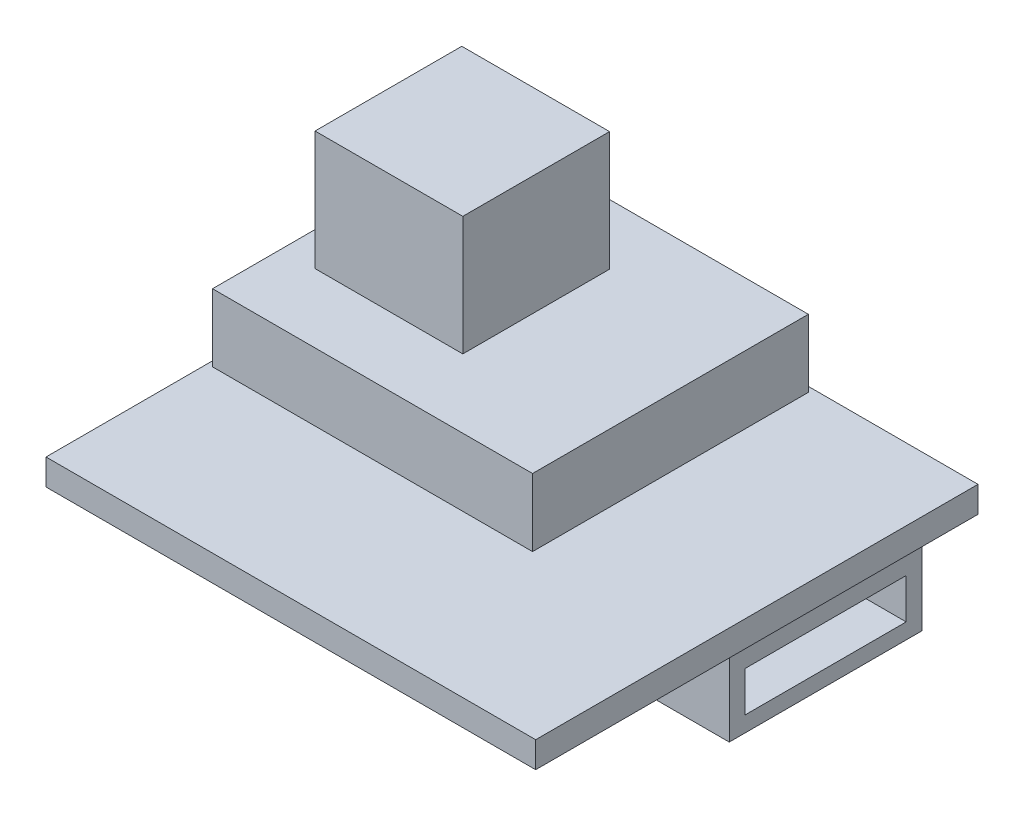
ISO-10303-21;
HEADER;
FILE_DESCRIPTION(('STEP AP214'),'2;1');
FILE_NAME('part.step','',(''),(''),'','','');
FILE_SCHEMA(('AUTOMOTIVE_DESIGN { 1 0 10303 214 1 1 1 1 }'));
ENDSEC;
DATA;
#1=APPLICATION_CONTEXT('core data for automotive mechanical design processes');
#2=APPLICATION_PROTOCOL_DEFINITION('international standard','automotive_design',2000,#1);
#3=PRODUCT_CONTEXT('',#1,'mechanical');
#4=PRODUCT('Part','Part','',(#3));
#5=PRODUCT_RELATED_PRODUCT_CATEGORY('part','',(#4));
#6=PRODUCT_DEFINITION_FORMATION('','',#4);
#7=PRODUCT_DEFINITION_CONTEXT('part definition',#1,'design');
#8=PRODUCT_DEFINITION('design','',#6,#7);
#9=PRODUCT_DEFINITION_SHAPE('','',#8);
#10=(LENGTH_UNIT() NAMED_UNIT(*) SI_UNIT(.MILLI.,.METRE.));
#11=(NAMED_UNIT(*) PLANE_ANGLE_UNIT() SI_UNIT($,.RADIAN.));
#12=(NAMED_UNIT(*) SI_UNIT($,.STERADIAN.) SOLID_ANGLE_UNIT());
#13=UNCERTAINTY_MEASURE_WITH_UNIT(LENGTH_MEASURE(1.E-05),#10,'distance_accuracy_value','');
#14=(GEOMETRIC_REPRESENTATION_CONTEXT(3) GLOBAL_UNCERTAINTY_ASSIGNED_CONTEXT((#13)) GLOBAL_UNIT_ASSIGNED_CONTEXT((#10,
#11,#12)) REPRESENTATION_CONTEXT('',''));
#15=CARTESIAN_POINT('',(0.,0.,0.));
#16=DIRECTION('',(0.,0.,1.));
#17=DIRECTION('',(1.,0.,0.));
#18=AXIS2_PLACEMENT_3D('',#15,#16,#17);
#19=CARTESIAN_POINT('',(0.,0.,0.));
#20=DIRECTION('',(0.,-1.,0.));
#21=DIRECTION('',(0.,0.,-1.));
#22=AXIS2_PLACEMENT_3D('',#19,#20,#21);
#23=PLANE('',#22);
#24=DIRECTION('',(1.,0.,0.));
#25=VECTOR('',#24,1.);
#26=CARTESIAN_POINT('',(8.6614,0.,-16.8656));
#27=LINE('',#26,#25);
#28=CARTESIAN_POINT('',(8.6614,0.,-16.8656));
#29=VERTEX_POINT('',#28);
#30=CARTESIAN_POINT('',(12.8524,0.,-16.8656));
#31=VERTEX_POINT('',#30);
#32=EDGE_CURVE('E279',#29,#31,#27,.T.);
#33=ORIENTED_EDGE('',*,*,#32,.F.);
#34=DIRECTION('',(0.,0.,-1.));
#35=VECTOR('',#34,1.);
#36=CARTESIAN_POINT('',(8.6614,0.,-9.8298));
#37=LINE('',#36,#35);
#38=CARTESIAN_POINT('',(8.6614,0.,-9.8298));
#39=VERTEX_POINT('',#38);
#40=EDGE_CURVE('E265',#39,#29,#37,.T.);
#41=ORIENTED_EDGE('',*,*,#40,.F.);
#42=DIRECTION('',(-1.,0.,0.));
#43=VECTOR('',#42,1.);
#44=CARTESIAN_POINT('',(8.6614,0.,-9.8298));
#45=LINE('',#44,#43);
#46=CARTESIAN_POINT('',(12.8524,0.,-9.8298));
#47=VERTEX_POINT('',#46);
#48=EDGE_CURVE('E270',#47,#39,#45,.T.);
#49=ORIENTED_EDGE('',*,*,#48,.F.);
#50=DIRECTION('',(0.,0.,1.));
#51=VECTOR('',#50,1.);
#52=CARTESIAN_POINT('',(12.8524,0.,-9.8298));
#53=LINE('',#52,#51);
#54=EDGE_CURVE('E281',#31,#47,#53,.T.);
#55=ORIENTED_EDGE('',*,*,#54,.F.);
#56=EDGE_LOOP('',(#33,#41,#49,#55));
#57=FACE_BOUND('',#56,.T.);
#58=DIRECTION('',(0.,0.,1.));
#59=VECTOR('',#58,1.);
#60=CARTESIAN_POINT('',(0.,0.,0.));
#61=LINE('',#60,#59);
#62=CARTESIAN_POINT('',(0.,0.,-21.59));
#63=VERTEX_POINT('',#62);
#64=CARTESIAN_POINT('',(0.,0.,0.));
#65=VERTEX_POINT('',#64);
#66=EDGE_CURVE('E356',#63,#65,#61,.T.);
#67=ORIENTED_EDGE('',*,*,#66,.F.);
#68=DIRECTION('',(-1.,0.,0.));
#69=VECTOR('',#68,1.);
#70=CARTESIAN_POINT('',(0.,0.,-21.59));
#71=LINE('',#70,#69);
#72=CARTESIAN_POINT('',(23.9014,0.,-21.59));
#73=VERTEX_POINT('',#72);
#74=EDGE_CURVE('E361',#73,#63,#71,.T.);
#75=ORIENTED_EDGE('',*,*,#74,.F.);
#76=DIRECTION('',(0.,0.,-1.));
#77=VECTOR('',#76,1.);
#78=CARTESIAN_POINT('',(23.9014,0.,0.));
#79=LINE('',#78,#77);
#80=CARTESIAN_POINT('',(23.9014,0.,0.));
#81=VERTEX_POINT('',#80);
#82=EDGE_CURVE('E372',#81,#73,#79,.T.);
#83=ORIENTED_EDGE('',*,*,#82,.F.);
#84=DIRECTION('',(1.,0.,0.));
#85=VECTOR('',#84,1.);
#86=CARTESIAN_POINT('',(0.,0.,0.));
#87=LINE('',#86,#85);
#88=EDGE_CURVE('E370',#65,#81,#87,.T.);
#89=ORIENTED_EDGE('',*,*,#88,.F.);
#90=EDGE_LOOP('',(#67,#75,#83,#89));
#91=FACE_BOUND('',#90,.T.);
#92=DIRECTION('',(1.,0.,0.));
#93=VECTOR('',#92,1.);
#94=CARTESIAN_POINT('',(19.0754,0.,-19.1008));
#95=LINE('',#94,#93);
#96=CARTESIAN_POINT('',(19.0754,0.,-19.1008));
#97=VERTEX_POINT('',#96);
#98=CARTESIAN_POINT('',(23.6474,0.,-19.1008));
#99=VERTEX_POINT('',#98);
#100=EDGE_CURVE('E252',#97,#99,#95,.T.);
#101=ORIENTED_EDGE('',*,*,#100,.F.);
#102=DIRECTION('',(0.,0.,-1.));
#103=VECTOR('',#102,1.);
#104=CARTESIAN_POINT('',(19.0754,0.,-9.7028));
#105=LINE('',#104,#103);
#106=CARTESIAN_POINT('',(19.0754,0.,-9.7028));
#107=VERTEX_POINT('',#106);
#108=EDGE_CURVE('E237',#107,#97,#105,.T.);
#109=ORIENTED_EDGE('',*,*,#108,.F.);
#110=DIRECTION('',(-1.,0.,0.));
#111=VECTOR('',#110,1.);
#112=CARTESIAN_POINT('',(19.0754,0.,-9.7028));
#113=LINE('',#112,#111);
#114=CARTESIAN_POINT('',(23.6474,0.,-9.7028));
#115=VERTEX_POINT('',#114);
#116=EDGE_CURVE('E243',#115,#107,#113,.T.);
#117=ORIENTED_EDGE('',*,*,#116,.F.);
#118=DIRECTION('',(0.,0.,1.));
#119=VECTOR('',#118,1.);
#120=CARTESIAN_POINT('',(23.6474,0.,-9.7028));
#121=LINE('',#120,#119);
#122=EDGE_CURVE('E254',#99,#115,#121,.T.);
#123=ORIENTED_EDGE('',*,*,#122,.F.);
#124=EDGE_LOOP('',(#101,#109,#117,#123));
#125=FACE_BOUND('',#124,.T.);
#126=ADVANCED_FACE('F41',(#57,#91,#125),#23,.T.);
#127=CARTESIAN_POINT('',(0.,4.572,0.));
#128=DIRECTION('',(0.,1.,0.));
#129=DIRECTION('',(0.,0.,1.));
#130=AXIS2_PLACEMENT_3D('',#127,#128,#129);
#131=PLANE('',#130);
#132=DIRECTION('',(0.,0.,1.));
#133=VECTOR('',#132,1.);
#134=CARTESIAN_POINT('',(0.253999999999993,4.572,-21.336));
#135=LINE('',#134,#133);
#136=CARTESIAN_POINT('',(0.253999999999993,4.572,-21.336));
#137=VERTEX_POINT('',#136);
#138=CARTESIAN_POINT('',(0.253999999999995,4.572,-7.874));
#139=VERTEX_POINT('',#138);
#140=EDGE_CURVE('E324',#137,#139,#135,.T.);
#141=ORIENTED_EDGE('',*,*,#140,.T.);
#142=DIRECTION('',(1.,0.,0.));
#143=VECTOR('',#142,1.);
#144=CARTESIAN_POINT('',(0.253999999999995,4.572,-7.874));
#145=LINE('',#144,#143);
#146=CARTESIAN_POINT('',(15.875,4.572,-7.874));
#147=VERTEX_POINT('',#146);
#148=EDGE_CURVE('E327',#139,#147,#145,.T.);
#149=ORIENTED_EDGE('',*,*,#148,.T.);
#150=DIRECTION('',(0.,0.,-1.));
#151=VECTOR('',#150,1.);
#152=CARTESIAN_POINT('',(15.875,4.572,-21.336));
#153=LINE('',#152,#151);
#154=CARTESIAN_POINT('',(15.875,4.572,-21.336));
#155=VERTEX_POINT('',#154);
#156=EDGE_CURVE('E330',#147,#155,#153,.T.);
#157=ORIENTED_EDGE('',*,*,#156,.T.);
#158=DIRECTION('',(-1.,0.,0.));
#159=VECTOR('',#158,1.);
#160=CARTESIAN_POINT('',(0.253999999999993,4.572,-21.336));
#161=LINE('',#160,#159);
#162=EDGE_CURVE('E332',#155,#137,#161,.T.);
#163=ORIENTED_EDGE('',*,*,#162,.T.);
#164=EDGE_LOOP('',(#141,#149,#157,#163));
#165=FACE_BOUND('',#164,.T.);
#166=DIRECTION('',(1.,0.,0.));
#167=VECTOR('',#166,1.);
#168=CARTESIAN_POINT('',(1.90499999999999,4.572,-11.2268));
#169=LINE('',#168,#167);
#170=CARTESIAN_POINT('',(1.90499999999999,4.572,-11.2268));
#171=VERTEX_POINT('',#170);
#172=CARTESIAN_POINT('',(9.11859999999999,4.572,-11.2268));
#173=VERTEX_POINT('',#172);
#174=EDGE_CURVE('E308',#171,#173,#169,.T.);
#175=ORIENTED_EDGE('',*,*,#174,.F.);
#176=DIRECTION('',(0.,0.,1.));
#177=VECTOR('',#176,1.);
#178=CARTESIAN_POINT('',(1.90499999999999,4.572,-18.3896));
#179=LINE('',#178,#177);
#180=CARTESIAN_POINT('',(1.90499999999999,4.572,-18.3896));
#181=VERTEX_POINT('',#180);
#182=EDGE_CURVE('E294',#181,#171,#179,.T.);
#183=ORIENTED_EDGE('',*,*,#182,.F.);
#184=DIRECTION('',(-1.,0.,0.));
#185=VECTOR('',#184,1.);
#186=CARTESIAN_POINT('',(1.90499999999999,4.572,-18.3896));
#187=LINE('',#186,#185);
#188=CARTESIAN_POINT('',(9.11859999999999,4.572,-18.3896));
#189=VERTEX_POINT('',#188);
#190=EDGE_CURVE('E299',#189,#181,#187,.T.);
#191=ORIENTED_EDGE('',*,*,#190,.F.);
#192=DIRECTION('',(0.,0.,-1.));
#193=VECTOR('',#192,1.);
#194=CARTESIAN_POINT('',(9.11859999999999,4.572,-18.3896));
#195=LINE('',#194,#193);
#196=EDGE_CURVE('E310',#173,#189,#195,.T.);
#197=ORIENTED_EDGE('',*,*,#196,.F.);
#198=EDGE_LOOP('',(#175,#183,#191,#197));
#199=FACE_BOUND('',#198,.T.);
#200=ADVANCED_FACE('F409',(#165,#199),#131,.T.);
#201=CARTESIAN_POINT('',(0.,1.27,0.));
#202=DIRECTION('',(0.,-1.,0.));
#203=DIRECTION('',(0.,0.,-1.));
#204=AXIS2_PLACEMENT_3D('',#201,#202,#203);
#205=PLANE('',#204);
#206=DIRECTION('',(0.,0.,1.));
#207=VECTOR('',#206,1.);
#208=CARTESIAN_POINT('',(0.,1.27,0.));
#209=LINE('',#208,#207);
#210=CARTESIAN_POINT('',(0.,1.27,-21.59));
#211=VERTEX_POINT('',#210);
#212=CARTESIAN_POINT('',(0.,1.27,0.));
#213=VERTEX_POINT('',#212);
#214=EDGE_CURVE('E357',#211,#213,#209,.T.);
#215=ORIENTED_EDGE('',*,*,#214,.T.);
#216=DIRECTION('',(1.,0.,0.));
#217=VECTOR('',#216,1.);
#218=CARTESIAN_POINT('',(0.,1.27,0.));
#219=LINE('',#218,#217);
#220=CARTESIAN_POINT('',(23.9014,1.27,0.));
#221=VERTEX_POINT('',#220);
#222=EDGE_CURVE('E360',#213,#221,#219,.T.);
#223=ORIENTED_EDGE('',*,*,#222,.T.);
#224=DIRECTION('',(0.,0.,-1.));
#225=VECTOR('',#224,1.);
#226=CARTESIAN_POINT('',(23.9014,1.27,0.));
#227=LINE('',#226,#225);
#228=CARTESIAN_POINT('',(23.9014,1.27,-21.59));
#229=VERTEX_POINT('',#228);
#230=EDGE_CURVE('E363',#221,#229,#227,.T.);
#231=ORIENTED_EDGE('',*,*,#230,.T.);
#232=DIRECTION('',(-1.,0.,0.));
#233=VECTOR('',#232,1.);
#234=CARTESIAN_POINT('',(0.,1.27,-21.59));
#235=LINE('',#234,#233);
#236=EDGE_CURVE('E365',#229,#211,#235,.T.);
#237=ORIENTED_EDGE('',*,*,#236,.T.);
#238=EDGE_LOOP('',(#215,#223,#231,#237));
#239=FACE_BOUND('',#238,.T.);
#240=DIRECTION('',(0.,0.,1.));
#241=VECTOR('',#240,1.);
#242=CARTESIAN_POINT('',(0.253999999999993,1.27,-21.336));
#243=LINE('',#242,#241);
#244=CARTESIAN_POINT('',(0.253999999999993,1.27,-21.336));
#245=VERTEX_POINT('',#244);
#246=CARTESIAN_POINT('',(0.253999999999995,1.27,-7.874));
#247=VERTEX_POINT('',#246);
#248=EDGE_CURVE('E323',#245,#247,#243,.T.);
#249=ORIENTED_EDGE('',*,*,#248,.F.);
#250=DIRECTION('',(-1.,0.,0.));
#251=VECTOR('',#250,1.);
#252=CARTESIAN_POINT('',(0.253999999999993,1.27,-21.336));
#253=LINE('',#252,#251);
#254=CARTESIAN_POINT('',(15.875,1.27,-21.336));
#255=VERTEX_POINT('',#254);
#256=EDGE_CURVE('E328',#255,#245,#253,.T.);
#257=ORIENTED_EDGE('',*,*,#256,.F.);
#258=DIRECTION('',(0.,0.,-1.));
#259=VECTOR('',#258,1.);
#260=CARTESIAN_POINT('',(15.875,1.27,-21.336));
#261=LINE('',#260,#259);
#262=CARTESIAN_POINT('',(15.875,1.27,-7.874));
#263=VERTEX_POINT('',#262);
#264=EDGE_CURVE('E340',#263,#255,#261,.T.);
#265=ORIENTED_EDGE('',*,*,#264,.F.);
#266=DIRECTION('',(1.,0.,0.));
#267=VECTOR('',#266,1.);
#268=CARTESIAN_POINT('',(0.253999999999995,1.27,-7.874));
#269=LINE('',#268,#267);
#270=EDGE_CURVE('E337',#247,#263,#269,.T.);
#271=ORIENTED_EDGE('',*,*,#270,.F.);
#272=EDGE_LOOP('',(#249,#257,#265,#271));
#273=FACE_BOUND('',#272,.T.);
#274=ADVANCED_FACE('F399',(#239,#273),#205,.F.);
#275=CARTESIAN_POINT('',(0.,1.27,0.));
#276=DIRECTION('',(1.,0.,0.));
#277=DIRECTION('',(0.,0.,-1.));
#278=AXIS2_PLACEMENT_3D('',#275,#276,#277);
#279=PLANE('',#278);
#280=ORIENTED_EDGE('',*,*,#66,.T.);
#281=DIRECTION('',(0.,-1.,0.));
#282=VECTOR('',#281,1.);
#283=CARTESIAN_POINT('',(0.,1.27,0.));
#284=LINE('',#283,#282);
#285=EDGE_CURVE('E12',#213,#65,#284,.T.);
#286=ORIENTED_EDGE('',*,*,#285,.F.);
#287=ORIENTED_EDGE('',*,*,#214,.F.);
#288=DIRECTION('',(0.,-1.,0.));
#289=VECTOR('',#288,1.);
#290=CARTESIAN_POINT('',(0.,1.27,-21.59));
#291=LINE('',#290,#289);
#292=EDGE_CURVE('E367',#211,#63,#291,.T.);
#293=ORIENTED_EDGE('',*,*,#292,.T.);
#294=EDGE_LOOP('',(#280,#286,#287,#293));
#295=FACE_BOUND('',#294,.T.);
#296=ADVANCED_FACE('F43',(#295),#279,.F.);
#297=CARTESIAN_POINT('',(0.,1.27,0.));
#298=DIRECTION('',(0.,0.,-1.));
#299=DIRECTION('',(-1.,0.,0.));
#300=AXIS2_PLACEMENT_3D('',#297,#298,#299);
#301=PLANE('',#300);
#302=ORIENTED_EDGE('',*,*,#88,.T.);
#303=DIRECTION('',(0.,-1.,0.));
#304=VECTOR('',#303,1.);
#305=CARTESIAN_POINT('',(23.9014,1.27,0.));
#306=LINE('',#305,#304);
#307=EDGE_CURVE('E49',#221,#81,#306,.T.);
#308=ORIENTED_EDGE('',*,*,#307,.F.);
#309=ORIENTED_EDGE('',*,*,#222,.F.);
#310=ORIENTED_EDGE('',*,*,#285,.T.);
#311=EDGE_LOOP('',(#302,#308,#309,#310));
#312=FACE_BOUND('',#311,.T.);
#313=ADVANCED_FACE('F401',(#312),#301,.F.);
#314=CARTESIAN_POINT('',(23.9014,1.27,0.));
#315=DIRECTION('',(-1.,0.,0.));
#316=DIRECTION('',(0.,0.,1.));
#317=AXIS2_PLACEMENT_3D('',#314,#315,#316);
#318=PLANE('',#317);
#319=ORIENTED_EDGE('',*,*,#82,.T.);
#320=DIRECTION('',(0.,-1.,0.));
#321=VECTOR('',#320,1.);
#322=CARTESIAN_POINT('',(23.9014,1.27,-21.59));
#323=LINE('',#322,#321);
#324=EDGE_CURVE('E377',#229,#73,#323,.T.);
#325=ORIENTED_EDGE('',*,*,#324,.F.);
#326=ORIENTED_EDGE('',*,*,#230,.F.);
#327=ORIENTED_EDGE('',*,*,#307,.T.);
#328=EDGE_LOOP('',(#319,#325,#326,#327));
#329=FACE_BOUND('',#328,.T.);
#330=ADVANCED_FACE('F384',(#329),#318,.F.);
#331=CARTESIAN_POINT('',(0.,1.27,-21.59));
#332=DIRECTION('',(0.,0.,1.));
#333=DIRECTION('',(1.,0.,0.));
#334=AXIS2_PLACEMENT_3D('',#331,#332,#333);
#335=PLANE('',#334);
#336=ORIENTED_EDGE('',*,*,#74,.T.);
#337=ORIENTED_EDGE('',*,*,#292,.F.);
#338=ORIENTED_EDGE('',*,*,#236,.F.);
#339=ORIENTED_EDGE('',*,*,#324,.T.);
#340=EDGE_LOOP('',(#336,#337,#338,#339));
#341=FACE_BOUND('',#340,.T.);
#342=ADVANCED_FACE('F393',(#341),#335,.F.);
#343=CARTESIAN_POINT('',(0.253999999999993,4.572,-21.336));
#344=DIRECTION('',(1.,0.,0.));
#345=DIRECTION('',(0.,0.,-1.));
#346=AXIS2_PLACEMENT_3D('',#343,#344,#345);
#347=PLANE('',#346);
#348=ORIENTED_EDGE('',*,*,#248,.T.);
#349=DIRECTION('',(0.,-1.,0.));
#350=VECTOR('',#349,1.);
#351=CARTESIAN_POINT('',(0.253999999999995,4.572,-7.874));
#352=LINE('',#351,#350);
#353=EDGE_CURVE('E353',#139,#247,#352,.T.);
#354=ORIENTED_EDGE('',*,*,#353,.F.);
#355=ORIENTED_EDGE('',*,*,#140,.F.);
#356=DIRECTION('',(0.,-1.,0.));
#357=VECTOR('',#356,1.);
#358=CARTESIAN_POINT('',(0.253999999999993,4.572,-21.336));
#359=LINE('',#358,#357);
#360=EDGE_CURVE('E334',#137,#245,#359,.T.);
#361=ORIENTED_EDGE('',*,*,#360,.T.);
#362=EDGE_LOOP('',(#348,#354,#355,#361));
#363=FACE_BOUND('',#362,.T.);
#364=ADVANCED_FACE('F422',(#363),#347,.F.);
#365=CARTESIAN_POINT('',(0.253999999999995,4.572,-7.874));
#366=DIRECTION('',(0.,0.,-1.));
#367=DIRECTION('',(-1.,0.,0.));
#368=AXIS2_PLACEMENT_3D('',#365,#366,#367);
#369=PLANE('',#368);
#370=ORIENTED_EDGE('',*,*,#270,.T.);
#371=DIRECTION('',(0.,-1.,0.));
#372=VECTOR('',#371,1.);
#373=CARTESIAN_POINT('',(15.875,4.572,-7.874));
#374=LINE('',#373,#372);
#375=EDGE_CURVE('E350',#147,#263,#374,.T.);
#376=ORIENTED_EDGE('',*,*,#375,.F.);
#377=ORIENTED_EDGE('',*,*,#148,.F.);
#378=ORIENTED_EDGE('',*,*,#353,.T.);
#379=EDGE_LOOP('',(#370,#376,#377,#378));
#380=FACE_BOUND('',#379,.T.);
#381=ADVANCED_FACE('F426',(#380),#369,.F.);
#382=CARTESIAN_POINT('',(15.875,4.572,-21.336));
#383=DIRECTION('',(-1.,0.,0.));
#384=DIRECTION('',(0.,0.,1.));
#385=AXIS2_PLACEMENT_3D('',#382,#383,#384);
#386=PLANE('',#385);
#387=ORIENTED_EDGE('',*,*,#264,.T.);
#388=DIRECTION('',(0.,-1.,0.));
#389=VECTOR('',#388,1.);
#390=CARTESIAN_POINT('',(15.875,4.572,-21.336));
#391=LINE('',#390,#389);
#392=EDGE_CURVE('E347',#155,#255,#391,.T.);
#393=ORIENTED_EDGE('',*,*,#392,.F.);
#394=ORIENTED_EDGE('',*,*,#156,.F.);
#395=ORIENTED_EDGE('',*,*,#375,.T.);
#396=EDGE_LOOP('',(#387,#393,#394,#395));
#397=FACE_BOUND('',#396,.T.);
#398=ADVANCED_FACE('F431',(#397),#386,.F.);
#399=CARTESIAN_POINT('',(0.253999999999993,4.572,-21.336));
#400=DIRECTION('',(0.,0.,1.));
#401=DIRECTION('',(1.,0.,0.));
#402=AXIS2_PLACEMENT_3D('',#399,#400,#401);
#403=PLANE('',#402);
#404=ORIENTED_EDGE('',*,*,#256,.T.);
#405=ORIENTED_EDGE('',*,*,#360,.F.);
#406=ORIENTED_EDGE('',*,*,#162,.F.);
#407=ORIENTED_EDGE('',*,*,#392,.T.);
#408=EDGE_LOOP('',(#404,#405,#406,#407));
#409=FACE_BOUND('',#408,.T.);
#410=ADVANCED_FACE('F437',(#409),#403,.F.);
#411=CARTESIAN_POINT('',(1.90499999999999,10.3886,-18.3896));
#412=DIRECTION('',(1.,0.,0.));
#413=DIRECTION('',(0.,0.,-1.));
#414=AXIS2_PLACEMENT_3D('',#411,#412,#413);
#415=PLANE('',#414);
#416=ORIENTED_EDGE('',*,*,#182,.T.);
#417=DIRECTION('',(0.,-1.,0.));
#418=VECTOR('',#417,1.);
#419=CARTESIAN_POINT('',(1.90499999999999,10.3886,-11.2268));
#420=LINE('',#419,#418);
#421=CARTESIAN_POINT('',(1.90499999999999,10.3886,-11.2268));
#422=VERTEX_POINT('',#421);
#423=EDGE_CURVE('E321',#422,#171,#420,.T.);
#424=ORIENTED_EDGE('',*,*,#423,.F.);
#425=DIRECTION('',(0.,0.,1.));
#426=VECTOR('',#425,1.);
#427=CARTESIAN_POINT('',(1.90499999999999,10.3886,-18.3896));
#428=LINE('',#427,#426);
#429=CARTESIAN_POINT('',(1.90499999999999,10.3886,-18.3896));
#430=VERTEX_POINT('',#429);
#431=EDGE_CURVE('E295',#430,#422,#428,.T.);
#432=ORIENTED_EDGE('',*,*,#431,.F.);
#433=DIRECTION('',(0.,-1.,0.));
#434=VECTOR('',#433,1.);
#435=CARTESIAN_POINT('',(1.90499999999999,10.3886,-18.3896));
#436=LINE('',#435,#434);
#437=EDGE_CURVE('E305',#430,#181,#436,.T.);
#438=ORIENTED_EDGE('',*,*,#437,.T.);
#439=EDGE_LOOP('',(#416,#424,#432,#438));
#440=FACE_BOUND('',#439,.T.);
#441=ADVANCED_FACE('F440',(#440),#415,.F.);
#442=CARTESIAN_POINT('',(1.90499999999999,10.3886,-11.2268));
#443=DIRECTION('',(0.,0.,-1.));
#444=DIRECTION('',(-1.,0.,0.));
#445=AXIS2_PLACEMENT_3D('',#442,#443,#444);
#446=PLANE('',#445);
#447=ORIENTED_EDGE('',*,*,#174,.T.);
#448=DIRECTION('',(0.,-1.,0.));
#449=VECTOR('',#448,1.);
#450=CARTESIAN_POINT('',(9.11859999999999,10.3886,-11.2268));
#451=LINE('',#450,#449);
#452=CARTESIAN_POINT('',(9.11859999999999,10.3886,-11.2268));
#453=VERTEX_POINT('',#452);
#454=EDGE_CURVE('E318',#453,#173,#451,.T.);
#455=ORIENTED_EDGE('',*,*,#454,.F.);
#456=DIRECTION('',(1.,0.,0.));
#457=VECTOR('',#456,1.);
#458=CARTESIAN_POINT('',(1.90499999999999,10.3886,-11.2268));
#459=LINE('',#458,#457);
#460=EDGE_CURVE('E298',#422,#453,#459,.T.);
#461=ORIENTED_EDGE('',*,*,#460,.F.);
#462=ORIENTED_EDGE('',*,*,#423,.T.);
#463=EDGE_LOOP('',(#447,#455,#461,#462));
#464=FACE_BOUND('',#463,.T.);
#465=ADVANCED_FACE('F445',(#464),#446,.F.);
#466=CARTESIAN_POINT('',(9.11859999999999,10.3886,-18.3896));
#467=DIRECTION('',(-1.,0.,0.));
#468=DIRECTION('',(0.,0.,1.));
#469=AXIS2_PLACEMENT_3D('',#466,#467,#468);
#470=PLANE('',#469);
#471=ORIENTED_EDGE('',*,*,#196,.T.);
#472=DIRECTION('',(0.,-1.,0.));
#473=VECTOR('',#472,1.);
#474=CARTESIAN_POINT('',(9.11859999999999,10.3886,-18.3896));
#475=LINE('',#474,#473);
#476=CARTESIAN_POINT('',(9.11859999999999,10.3886,-18.3896));
#477=VERTEX_POINT('',#476);
#478=EDGE_CURVE('E316',#477,#189,#475,.T.);
#479=ORIENTED_EDGE('',*,*,#478,.F.);
#480=DIRECTION('',(0.,0.,-1.));
#481=VECTOR('',#480,1.);
#482=CARTESIAN_POINT('',(9.11859999999999,10.3886,-18.3896));
#483=LINE('',#482,#481);
#484=EDGE_CURVE('E301',#453,#477,#483,.T.);
#485=ORIENTED_EDGE('',*,*,#484,.F.);
#486=ORIENTED_EDGE('',*,*,#454,.T.);
#487=EDGE_LOOP('',(#471,#479,#485,#486));
#488=FACE_BOUND('',#487,.T.);
#489=ADVANCED_FACE('F449',(#488),#470,.F.);
#490=CARTESIAN_POINT('',(1.90499999999999,10.3886,-18.3896));
#491=DIRECTION('',(0.,0.,1.));
#492=DIRECTION('',(1.,0.,0.));
#493=AXIS2_PLACEMENT_3D('',#490,#491,#492);
#494=PLANE('',#493);
#495=ORIENTED_EDGE('',*,*,#190,.T.);
#496=ORIENTED_EDGE('',*,*,#437,.F.);
#497=DIRECTION('',(-1.,0.,0.));
#498=VECTOR('',#497,1.);
#499=CARTESIAN_POINT('',(1.90499999999999,10.3886,-18.3896));
#500=LINE('',#499,#498);
#501=EDGE_CURVE('E303',#477,#430,#500,.T.);
#502=ORIENTED_EDGE('',*,*,#501,.F.);
#503=ORIENTED_EDGE('',*,*,#478,.T.);
#504=EDGE_LOOP('',(#495,#496,#502,#503));
#505=FACE_BOUND('',#504,.T.);
#506=ADVANCED_FACE('F453',(#505),#494,.F.);
#507=CARTESIAN_POINT('',(0.,10.3886,0.));
#508=DIRECTION('',(0.,1.,0.));
#509=DIRECTION('',(0.,0.,1.));
#510=AXIS2_PLACEMENT_3D('',#507,#508,#509);
#511=PLANE('',#510);
#512=ORIENTED_EDGE('',*,*,#431,.T.);
#513=ORIENTED_EDGE('',*,*,#460,.T.);
#514=ORIENTED_EDGE('',*,*,#484,.T.);
#515=ORIENTED_EDGE('',*,*,#501,.T.);
#516=EDGE_LOOP('',(#512,#513,#514,#515));
#517=FACE_BOUND('',#516,.T.);
#518=ADVANCED_FACE('F457',(#517),#511,.T.);
#519=CARTESIAN_POINT('',(8.6614,-4.5212,-9.8298));
#520=DIRECTION('',(1.,0.,0.));
#521=DIRECTION('',(0.,0.,-1.));
#522=AXIS2_PLACEMENT_3D('',#519,#520,#521);
#523=PLANE('',#522);
#524=ORIENTED_EDGE('',*,*,#40,.T.);
#525=DIRECTION('',(0.,1.,0.));
#526=VECTOR('',#525,1.);
#527=CARTESIAN_POINT('',(8.6614,-4.5212,-16.8656));
#528=LINE('',#527,#526);
#529=CARTESIAN_POINT('',(8.6614,-4.5212,-16.8656));
#530=VERTEX_POINT('',#529);
#531=EDGE_CURVE('E292',#530,#29,#528,.T.);
#532=ORIENTED_EDGE('',*,*,#531,.F.);
#533=DIRECTION('',(0.,0.,-1.));
#534=VECTOR('',#533,1.);
#535=CARTESIAN_POINT('',(8.6614,-4.5212,-9.8298));
#536=LINE('',#535,#534);
#537=CARTESIAN_POINT('',(8.6614,-4.5212,-9.8298));
#538=VERTEX_POINT('',#537);
#539=EDGE_CURVE('E266',#538,#530,#536,.T.);
#540=ORIENTED_EDGE('',*,*,#539,.F.);
#541=DIRECTION('',(0.,1.,0.));
#542=VECTOR('',#541,1.);
#543=CARTESIAN_POINT('',(8.6614,-4.5212,-9.8298));
#544=LINE('',#543,#542);
#545=EDGE_CURVE('E276',#538,#39,#544,.T.);
#546=ORIENTED_EDGE('',*,*,#545,.T.);
#547=EDGE_LOOP('',(#524,#532,#540,#546));
#548=FACE_BOUND('',#547,.T.);
#549=ADVANCED_FACE('F461',(#548),#523,.F.);
#550=CARTESIAN_POINT('',(8.6614,-4.5212,-16.8656));
#551=DIRECTION('',(0.,0.,1.));
#552=DIRECTION('',(1.,0.,0.));
#553=AXIS2_PLACEMENT_3D('',#550,#551,#552);
#554=PLANE('',#553);
#555=ORIENTED_EDGE('',*,*,#32,.T.);
#556=DIRECTION('',(0.,1.,0.));
#557=VECTOR('',#556,1.);
#558=CARTESIAN_POINT('',(12.8524,-4.5212,-16.8656));
#559=LINE('',#558,#557);
#560=CARTESIAN_POINT('',(12.8524,-4.5212,-16.8656));
#561=VERTEX_POINT('',#560);
#562=EDGE_CURVE('E289',#561,#31,#559,.T.);
#563=ORIENTED_EDGE('',*,*,#562,.F.);
#564=DIRECTION('',(1.,0.,0.));
#565=VECTOR('',#564,1.);
#566=CARTESIAN_POINT('',(8.6614,-4.5212,-16.8656));
#567=LINE('',#566,#565);
#568=EDGE_CURVE('E269',#530,#561,#567,.T.);
#569=ORIENTED_EDGE('',*,*,#568,.F.);
#570=ORIENTED_EDGE('',*,*,#531,.T.);
#571=EDGE_LOOP('',(#555,#563,#569,#570));
#572=FACE_BOUND('',#571,.T.);
#573=ADVANCED_FACE('F465',(#572),#554,.F.);
#574=CARTESIAN_POINT('',(12.8524,-4.5212,-9.8298));
#575=DIRECTION('',(-1.,0.,0.));
#576=DIRECTION('',(0.,0.,1.));
#577=AXIS2_PLACEMENT_3D('',#574,#575,#576);
#578=PLANE('',#577);
#579=ORIENTED_EDGE('',*,*,#54,.T.);
#580=DIRECTION('',(0.,1.,0.));
#581=VECTOR('',#580,1.);
#582=CARTESIAN_POINT('',(12.8524,-4.5212,-9.8298));
#583=LINE('',#582,#581);
#584=CARTESIAN_POINT('',(12.8524,-4.5212,-9.8298));
#585=VERTEX_POINT('',#584);
#586=EDGE_CURVE('E287',#585,#47,#583,.T.);
#587=ORIENTED_EDGE('',*,*,#586,.F.);
#588=DIRECTION('',(0.,0.,1.));
#589=VECTOR('',#588,1.);
#590=CARTESIAN_POINT('',(12.8524,-4.5212,-9.8298));
#591=LINE('',#590,#589);
#592=EDGE_CURVE('E272',#561,#585,#591,.T.);
#593=ORIENTED_EDGE('',*,*,#592,.F.);
#594=ORIENTED_EDGE('',*,*,#562,.T.);
#595=EDGE_LOOP('',(#579,#587,#593,#594));
#596=FACE_BOUND('',#595,.T.);
#597=ADVANCED_FACE('F469',(#596),#578,.F.);
#598=CARTESIAN_POINT('',(8.6614,-4.5212,-9.8298));
#599=DIRECTION('',(0.,0.,-1.));
#600=DIRECTION('',(-1.,0.,0.));
#601=AXIS2_PLACEMENT_3D('',#598,#599,#600);
#602=PLANE('',#601);
#603=ORIENTED_EDGE('',*,*,#48,.T.);
#604=ORIENTED_EDGE('',*,*,#545,.F.);
#605=DIRECTION('',(-1.,0.,0.));
#606=VECTOR('',#605,1.);
#607=CARTESIAN_POINT('',(8.6614,-4.5212,-9.8298));
#608=LINE('',#607,#606);
#609=EDGE_CURVE('E274',#585,#538,#608,.T.);
#610=ORIENTED_EDGE('',*,*,#609,.F.);
#611=ORIENTED_EDGE('',*,*,#586,.T.);
#612=EDGE_LOOP('',(#603,#604,#610,#611));
#613=FACE_BOUND('',#612,.T.);
#614=ADVANCED_FACE('F473',(#613),#602,.F.);
#615=CARTESIAN_POINT('',(0.,-4.5212,0.));
#616=DIRECTION('',(0.,-1.,0.));
#617=DIRECTION('',(0.,0.,-1.));
#618=AXIS2_PLACEMENT_3D('',#615,#616,#617);
#619=PLANE('',#618);
#620=ORIENTED_EDGE('',*,*,#539,.T.);
#621=ORIENTED_EDGE('',*,*,#568,.T.);
#622=ORIENTED_EDGE('',*,*,#592,.T.);
#623=ORIENTED_EDGE('',*,*,#609,.T.);
#624=EDGE_LOOP('',(#620,#621,#622,#623));
#625=FACE_BOUND('',#624,.T.);
#626=ADVANCED_FACE('F477',(#625),#619,.T.);
#627=CARTESIAN_POINT('',(19.0754,-3.81,-9.7028));
#628=DIRECTION('',(1.,0.,0.));
#629=DIRECTION('',(0.,0.,-1.));
#630=AXIS2_PLACEMENT_3D('',#627,#628,#629);
#631=PLANE('',#630);
#632=ORIENTED_EDGE('',*,*,#108,.T.);
#633=DIRECTION('',(0.,1.,0.));
#634=VECTOR('',#633,1.);
#635=CARTESIAN_POINT('',(19.0754,-3.81,-19.1008));
#636=LINE('',#635,#634);
#637=CARTESIAN_POINT('',(19.0754,-3.81,-19.1008));
#638=VERTEX_POINT('',#637);
#639=EDGE_CURVE('E263',#638,#97,#636,.T.);
#640=ORIENTED_EDGE('',*,*,#639,.F.);
#641=DIRECTION('',(0.,0.,-1.));
#642=VECTOR('',#641,1.);
#643=CARTESIAN_POINT('',(19.0754,-3.81,-9.7028));
#644=LINE('',#643,#642);
#645=CARTESIAN_POINT('',(19.0754,-3.81,-9.7028));
#646=VERTEX_POINT('',#645);
#647=EDGE_CURVE('E239',#646,#638,#644,.T.);
#648=ORIENTED_EDGE('',*,*,#647,.F.);
#649=DIRECTION('',(0.,1.,0.));
#650=VECTOR('',#649,1.);
#651=CARTESIAN_POINT('',(19.0754,-3.81,-9.7028));
#652=LINE('',#651,#650);
#653=EDGE_CURVE('E249',#646,#107,#652,.T.);
#654=ORIENTED_EDGE('',*,*,#653,.T.);
#655=EDGE_LOOP('',(#632,#640,#648,#654));
#656=FACE_BOUND('',#655,.T.);
#657=ADVANCED_FACE('F481',(#656),#631,.F.);
#658=CARTESIAN_POINT('',(19.0754,-3.81,-19.1008));
#659=DIRECTION('',(0.,0.,1.));
#660=DIRECTION('',(1.,0.,0.));
#661=AXIS2_PLACEMENT_3D('',#658,#659,#660);
#662=PLANE('',#661);
#663=ORIENTED_EDGE('',*,*,#100,.T.);
#664=DIRECTION('',(0.,1.,0.));
#665=VECTOR('',#664,1.);
#666=CARTESIAN_POINT('',(23.6474,-3.81,-19.1008));
#667=LINE('',#666,#665);
#668=CARTESIAN_POINT('',(23.6474,-3.81,-19.1008));
#669=VERTEX_POINT('',#668);
#670=EDGE_CURVE('E260',#669,#99,#667,.T.);
#671=ORIENTED_EDGE('',*,*,#670,.F.);
#672=DIRECTION('',(1.,0.,0.));
#673=VECTOR('',#672,1.);
#674=CARTESIAN_POINT('',(19.0754,-3.81,-19.1008));
#675=LINE('',#674,#673);
#676=EDGE_CURVE('E242',#638,#669,#675,.T.);
#677=ORIENTED_EDGE('',*,*,#676,.F.);
#678=ORIENTED_EDGE('',*,*,#639,.T.);
#679=EDGE_LOOP('',(#663,#671,#677,#678));
#680=FACE_BOUND('',#679,.T.);
#681=ADVANCED_FACE('F485',(#680),#662,.F.);
#682=CARTESIAN_POINT('',(23.6474,-3.81,-9.7028));
#683=DIRECTION('',(-1.,0.,0.));
#684=DIRECTION('',(0.,0.,1.));
#685=AXIS2_PLACEMENT_3D('',#682,#683,#684);
#686=PLANE('',#685);
#687=DIRECTION('',(0.,0.,-1.));
#688=VECTOR('',#687,1.);
#689=CARTESIAN_POINT('',(23.6474,-3.048,-10.4648));
#690=LINE('',#689,#688);
#691=CARTESIAN_POINT('',(23.6474,-3.048,-10.4648));
#692=VERTEX_POINT('',#691);
#693=CARTESIAN_POINT('',(23.6474,-3.048,-18.3388));
#694=VERTEX_POINT('',#693);
#695=EDGE_CURVE('E219',#692,#694,#690,.T.);
#696=ORIENTED_EDGE('',*,*,#695,.F.);
#697=DIRECTION('',(0.,-1.,0.));
#698=VECTOR('',#697,1.);
#699=CARTESIAN_POINT('',(23.6474,-1.08614559717608,-10.4648));
#700=LINE('',#699,#698);
#701=CARTESIAN_POINT('',(23.6474,-1.08614559717608,-10.4648));
#702=VERTEX_POINT('',#701);
#703=EDGE_CURVE('E56',#702,#692,#700,.T.);
#704=ORIENTED_EDGE('',*,*,#703,.F.);
#705=DIRECTION('',(0.,0.,1.));
#706=VECTOR('',#705,1.);
#707=CARTESIAN_POINT('',(23.6474,-1.08614559717608,-10.4648));
#708=LINE('',#707,#706);
#709=CARTESIAN_POINT('',(23.6474,-1.08614559717608,-18.3388));
#710=VERTEX_POINT('',#709);
#711=EDGE_CURVE('E226',#710,#702,#708,.T.);
#712=ORIENTED_EDGE('',*,*,#711,.F.);
#713=DIRECTION('',(0.,1.,0.));
#714=VECTOR('',#713,1.);
#715=CARTESIAN_POINT('',(23.6474,-1.08614559717608,-18.3388));
#716=LINE('',#715,#714);
#717=EDGE_CURVE('E209',#694,#710,#716,.T.);
#718=ORIENTED_EDGE('',*,*,#717,.F.);
#719=EDGE_LOOP('',(#696,#704,#712,#718));
#720=FACE_BOUND('',#719,.T.);
#721=ORIENTED_EDGE('',*,*,#122,.T.);
#722=DIRECTION('',(0.,1.,0.));
#723=VECTOR('',#722,1.);
#724=CARTESIAN_POINT('',(23.6474,-3.81,-9.7028));
#725=LINE('',#724,#723);
#726=CARTESIAN_POINT('',(23.6474,-3.81,-9.7028));
#727=VERTEX_POINT('',#726);
#728=EDGE_CURVE('E64',#727,#115,#725,.T.);
#729=ORIENTED_EDGE('',*,*,#728,.F.);
#730=DIRECTION('',(0.,0.,1.));
#731=VECTOR('',#730,1.);
#732=CARTESIAN_POINT('',(23.6474,-3.81,-9.7028));
#733=LINE('',#732,#731);
#734=EDGE_CURVE('E245',#669,#727,#733,.T.);
#735=ORIENTED_EDGE('',*,*,#734,.F.);
#736=ORIENTED_EDGE('',*,*,#670,.T.);
#737=EDGE_LOOP('',(#721,#729,#735,#736));
#738=FACE_BOUND('',#737,.T.);
#739=ADVANCED_FACE('F223',(#720,#738),#686,.F.);
#740=CARTESIAN_POINT('',(19.0754,-3.81,-9.7028));
#741=DIRECTION('',(0.,0.,-1.));
#742=DIRECTION('',(-1.,0.,0.));
#743=AXIS2_PLACEMENT_3D('',#740,#741,#742);
#744=PLANE('',#743);
#745=ORIENTED_EDGE('',*,*,#116,.T.);
#746=ORIENTED_EDGE('',*,*,#653,.F.);
#747=DIRECTION('',(-1.,0.,0.));
#748=VECTOR('',#747,1.);
#749=CARTESIAN_POINT('',(19.0754,-3.81,-9.7028));
#750=LINE('',#749,#748);
#751=EDGE_CURVE('E247',#727,#646,#750,.T.);
#752=ORIENTED_EDGE('',*,*,#751,.F.);
#753=ORIENTED_EDGE('',*,*,#728,.T.);
#754=EDGE_LOOP('',(#745,#746,#752,#753));
#755=FACE_BOUND('',#754,.T.);
#756=ADVANCED_FACE('F492',(#755),#744,.F.);
#757=CARTESIAN_POINT('',(0.,-3.81,0.));
#758=DIRECTION('',(0.,-1.,0.));
#759=DIRECTION('',(0.,0.,-1.));
#760=AXIS2_PLACEMENT_3D('',#757,#758,#759);
#761=PLANE('',#760);
#762=ORIENTED_EDGE('',*,*,#647,.T.);
#763=ORIENTED_EDGE('',*,*,#676,.T.);
#764=ORIENTED_EDGE('',*,*,#734,.T.);
#765=ORIENTED_EDGE('',*,*,#751,.T.);
#766=EDGE_LOOP('',(#762,#763,#764,#765));
#767=FACE_BOUND('',#766,.T.);
#768=ADVANCED_FACE('F495',(#767),#761,.T.);
#769=CARTESIAN_POINT('',(10.9606758088842,-1.08614559717608,-10.4648));
#770=DIRECTION('',(0.,0.,1.));
#771=DIRECTION('',(1.,0.,0.));
#772=AXIS2_PLACEMENT_3D('',#769,#770,#771);
#773=PLANE('',#772);
#774=DIRECTION('',(0.,1.,0.));
#775=VECTOR('',#774,1.);
#776=CARTESIAN_POINT('',(19.8374,-1.08614559717608,-10.4648));
#777=LINE('',#776,#775);
#778=CARTESIAN_POINT('',(19.8374,-3.048,-10.4648));
#779=VERTEX_POINT('',#778);
#780=CARTESIAN_POINT('',(19.8374,-1.08614559717608,-10.4648));
#781=VERTEX_POINT('',#780);
#782=EDGE_CURVE('E238',#779,#781,#777,.T.);
#783=ORIENTED_EDGE('',*,*,#782,.T.);
#784=DIRECTION('',(1.,0.,0.));
#785=VECTOR('',#784,1.);
#786=CARTESIAN_POINT('',(10.9606758088842,-1.08614559717608,-10.4648));
#787=LINE('',#786,#785);
#788=EDGE_CURVE('E231',#781,#702,#787,.T.);
#789=ORIENTED_EDGE('',*,*,#788,.T.);
#790=ORIENTED_EDGE('',*,*,#703,.T.);
#791=DIRECTION('',(1.,0.,0.));
#792=VECTOR('',#791,1.);
#793=CARTESIAN_POINT('',(10.9606758088842,-3.048,-10.4648));
#794=LINE('',#793,#792);
#795=EDGE_CURVE('E216',#779,#692,#794,.T.);
#796=ORIENTED_EDGE('',*,*,#795,.F.);
#797=EDGE_LOOP('',(#783,#789,#790,#796));
#798=FACE_BOUND('',#797,.T.);
#799=ADVANCED_FACE('F498',(#798),#773,.F.);
#800=CARTESIAN_POINT('',(10.9606758088842,-1.08614559717608,-10.4648));
#801=DIRECTION('',(0.,1.,0.));
#802=DIRECTION('',(0.,0.,1.));
#803=AXIS2_PLACEMENT_3D('',#800,#801,#802);
#804=PLANE('',#803);
#805=DIRECTION('',(0.,0.,-1.));
#806=VECTOR('',#805,1.);
#807=CARTESIAN_POINT('',(19.8374,-1.08614559717608,-10.4648));
#808=LINE('',#807,#806);
#809=CARTESIAN_POINT('',(19.8374,-1.08614559717608,-18.3388));
#810=VERTEX_POINT('',#809);
#811=EDGE_CURVE('E517',#781,#810,#808,.T.);
#812=ORIENTED_EDGE('',*,*,#811,.T.);
#813=DIRECTION('',(1.,0.,0.));
#814=VECTOR('',#813,1.);
#815=CARTESIAN_POINT('',(10.9606758088842,-1.08614559717608,-18.3388));
#816=LINE('',#815,#814);
#817=EDGE_CURVE('E215',#810,#710,#816,.T.);
#818=ORIENTED_EDGE('',*,*,#817,.T.);
#819=ORIENTED_EDGE('',*,*,#711,.T.);
#820=ORIENTED_EDGE('',*,*,#788,.F.);
#821=EDGE_LOOP('',(#812,#818,#819,#820));
#822=FACE_BOUND('',#821,.T.);
#823=ADVANCED_FACE('F502',(#822),#804,.F.);
#824=CARTESIAN_POINT('',(10.9606758088842,-1.08614559717608,-18.3388));
#825=DIRECTION('',(0.,0.,-1.));
#826=DIRECTION('',(-1.,0.,0.));
#827=AXIS2_PLACEMENT_3D('',#824,#825,#826);
#828=PLANE('',#827);
#829=DIRECTION('',(0.,-1.,0.));
#830=VECTOR('',#829,1.);
#831=CARTESIAN_POINT('',(19.8374,-1.08614559717608,-18.3388));
#832=LINE('',#831,#830);
#833=CARTESIAN_POINT('',(19.8374,-3.048,-18.3388));
#834=VERTEX_POINT('',#833);
#835=EDGE_CURVE('E212',#810,#834,#832,.T.);
#836=ORIENTED_EDGE('',*,*,#835,.T.);
#837=DIRECTION('',(1.,0.,0.));
#838=VECTOR('',#837,1.);
#839=CARTESIAN_POINT('',(10.9606758088842,-3.048,-18.3388));
#840=LINE('',#839,#838);
#841=EDGE_CURVE('E204',#834,#694,#840,.T.);
#842=ORIENTED_EDGE('',*,*,#841,.T.);
#843=ORIENTED_EDGE('',*,*,#717,.T.);
#844=ORIENTED_EDGE('',*,*,#817,.F.);
#845=EDGE_LOOP('',(#836,#842,#843,#844));
#846=FACE_BOUND('',#845,.T.);
#847=ADVANCED_FACE('F206',(#846),#828,.F.);
#848=CARTESIAN_POINT('',(10.9606758088842,-3.048,-10.4648));
#849=DIRECTION('',(0.,-1.,0.));
#850=DIRECTION('',(0.,0.,-1.));
#851=AXIS2_PLACEMENT_3D('',#848,#849,#850);
#852=PLANE('',#851);
#853=DIRECTION('',(0.,0.,1.));
#854=VECTOR('',#853,1.);
#855=CARTESIAN_POINT('',(19.8374,-3.048,-10.4648));
#856=LINE('',#855,#854);
#857=EDGE_CURVE('E235',#834,#779,#856,.T.);
#858=ORIENTED_EDGE('',*,*,#857,.T.);
#859=ORIENTED_EDGE('',*,*,#795,.T.);
#860=ORIENTED_EDGE('',*,*,#695,.T.);
#861=ORIENTED_EDGE('',*,*,#841,.F.);
#862=EDGE_LOOP('',(#858,#859,#860,#861));
#863=FACE_BOUND('',#862,.T.);
#864=ADVANCED_FACE('F220',(#863),#852,.F.);
#865=CARTESIAN_POINT('',(19.8374,-3.81,-9.7028));
#866=DIRECTION('',(1.,0.,0.));
#867=DIRECTION('',(0.,0.,-1.));
#868=AXIS2_PLACEMENT_3D('',#865,#866,#867);
#869=PLANE('',#868);
#870=ORIENTED_EDGE('',*,*,#782,.F.);
#871=ORIENTED_EDGE('',*,*,#857,.F.);
#872=ORIENTED_EDGE('',*,*,#835,.F.);
#873=ORIENTED_EDGE('',*,*,#811,.F.);
#874=EDGE_LOOP('',(#870,#871,#872,#873));
#875=FACE_BOUND('',#874,.T.);
#876=ADVANCED_FACE('F505',(#875),#869,.T.);
#877=CLOSED_SHELL('',(#126,#200,#274,#296,#313,#330,#342,#364,#381,#398,#410,#441,#465,#489,
#506,#518,#549,#573,#597,#614,#626,#657,#681,#739,#756,#768,#799,#823,#847,#864,#876));
#878=MANIFOLD_SOLID_BREP('B2',#877);
#879=ADVANCED_BREP_SHAPE_REPRESENTATION('',(#18,#878),#14);
#880=SHAPE_DEFINITION_REPRESENTATION(#9,#879);
ENDSEC;
END-ISO-10303-21;
